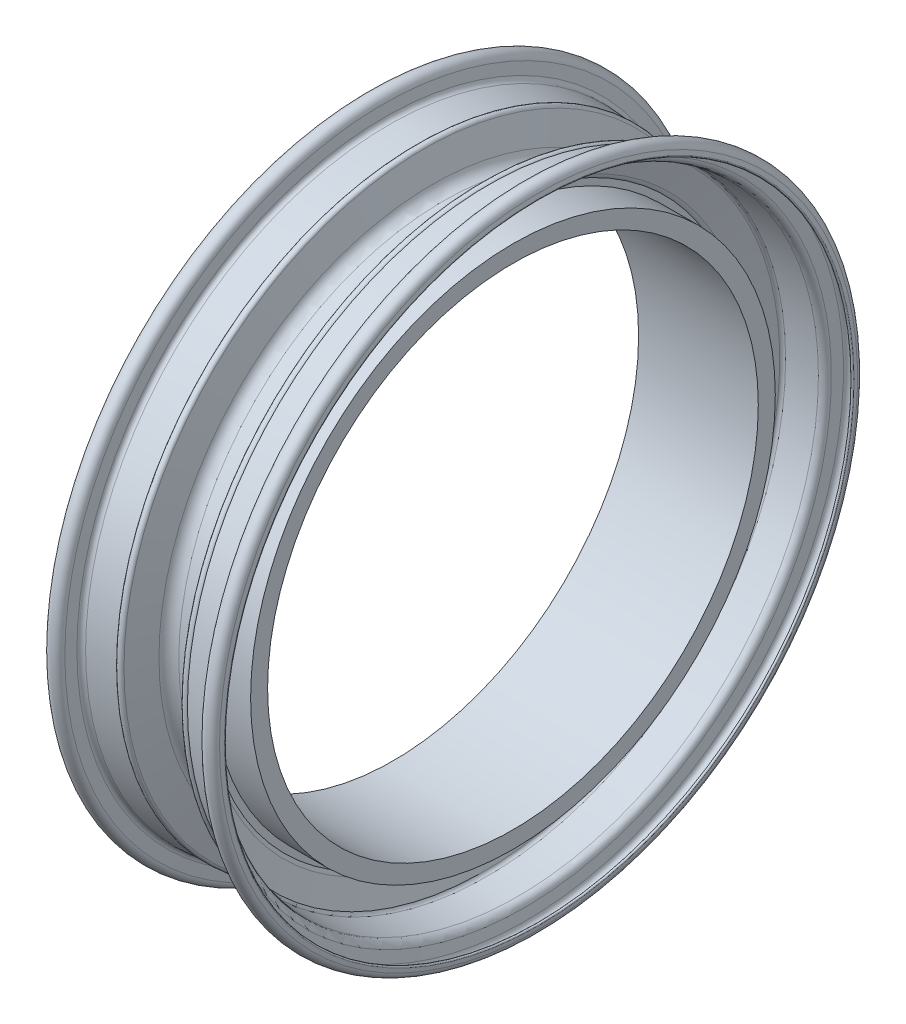
ISO-10303-21;
HEADER;
FILE_DESCRIPTION(('STEP AP214'),'2;1');
FILE_NAME('part.step','',(''),(''),'','','');
FILE_SCHEMA(('AUTOMOTIVE_DESIGN { 1 0 10303 214 1 1 1 1 }'));
ENDSEC;
DATA;
#1=APPLICATION_CONTEXT('core data for automotive mechanical design processes');
#2=APPLICATION_PROTOCOL_DEFINITION('international standard','automotive_design',2000,#1);
#3=PRODUCT_CONTEXT('',#1,'mechanical');
#4=PRODUCT('Part','Part','',(#3));
#5=PRODUCT_RELATED_PRODUCT_CATEGORY('part','',(#4));
#6=PRODUCT_DEFINITION_FORMATION('','',#4);
#7=PRODUCT_DEFINITION_CONTEXT('part definition',#1,'design');
#8=PRODUCT_DEFINITION('design','',#6,#7);
#9=PRODUCT_DEFINITION_SHAPE('','',#8);
#10=(LENGTH_UNIT() NAMED_UNIT(*) SI_UNIT(.MILLI.,.METRE.));
#11=(NAMED_UNIT(*) PLANE_ANGLE_UNIT() SI_UNIT($,.RADIAN.));
#12=(NAMED_UNIT(*) SI_UNIT($,.STERADIAN.) SOLID_ANGLE_UNIT());
#13=UNCERTAINTY_MEASURE_WITH_UNIT(LENGTH_MEASURE(1.E-05),#10,'distance_accuracy_value','');
#14=(GEOMETRIC_REPRESENTATION_CONTEXT(3) GLOBAL_UNCERTAINTY_ASSIGNED_CONTEXT((#13)) GLOBAL_UNIT_ASSIGNED_CONTEXT((#10,
#11,#12)) REPRESENTATION_CONTEXT('',''));
#15=CARTESIAN_POINT('',(0.,0.,0.));
#16=DIRECTION('',(0.,0.,1.));
#17=DIRECTION('',(1.,0.,0.));
#18=AXIS2_PLACEMENT_3D('',#15,#16,#17);
#19=CARTESIAN_POINT('',(-8.99999999999996,0.,0.));
#20=DIRECTION('',(-1.,0.,0.));
#21=DIRECTION('',(0.,0.,1.));
#22=AXIS2_PLACEMENT_3D('',#19,#20,#21);
#23=PLANE('',#22);
#24=CARTESIAN_POINT('',(-8.99999999999996,0.,0.));
#25=DIRECTION('',(1.,0.,0.));
#26=DIRECTION('',(0.,0.,-1.));
#27=AXIS2_PLACEMENT_3D('',#24,#25,#26);
#28=CIRCLE('',#27,112.283375209645);
#29=CARTESIAN_POINT('',(-8.99999999999996,0.,-112.283375209645));
#30=VERTEX_POINT('',#29);
#31=EDGE_CURVE('E72',#30,#30,#28,.F.);
#32=ORIENTED_EDGE('',*,*,#31,.T.);
#33=EDGE_LOOP('',(#32));
#34=FACE_BOUND('',#33,.T.);
#35=CARTESIAN_POINT('',(-8.99999999999995,0.,0.));
#36=DIRECTION('',(-1.,0.,0.));
#37=DIRECTION('',(0.,0.,1.));
#38=AXIS2_PLACEMENT_3D('',#35,#36,#37);
#39=CIRCLE('',#38,109.600000000001);
#40=CARTESIAN_POINT('',(-8.99999999999995,0.,109.600000000001));
#41=VERTEX_POINT('',#40);
#42=EDGE_CURVE('E10',#41,#41,#39,.T.);
#43=ORIENTED_EDGE('',*,*,#42,.F.);
#44=EDGE_LOOP('',(#43));
#45=FACE_BOUND('',#44,.T.);
#46=ADVANCED_FACE('F44',(#34,#45),#23,.T.);
#47=CARTESIAN_POINT('',(-265.819064472506,0.,0.));
#48=DIRECTION('',(-1.,0.,0.));
#49=DIRECTION('',(0.,0.,1.));
#50=AXIS2_PLACEMENT_3D('',#47,#48,#49);
#51=CYLINDRICAL_SURFACE('',#50,109.6);
#52=ORIENTED_EDGE('',*,*,#42,.T.);
#53=EDGE_LOOP('',(#52));
#54=FACE_BOUND('',#53,.T.);
#55=CARTESIAN_POINT('',(-25.,0.,0.));
#56=DIRECTION('',(-1.,0.,0.));
#57=DIRECTION('',(0.,0.,1.));
#58=AXIS2_PLACEMENT_3D('',#55,#56,#57);
#59=CIRCLE('',#58,109.6);
#60=CARTESIAN_POINT('',(-25.,0.,109.6));
#61=VERTEX_POINT('',#60);
#62=EDGE_CURVE('E50',#61,#61,#59,.T.);
#63=ORIENTED_EDGE('',*,*,#62,.F.);
#64=EDGE_LOOP('',(#63));
#65=FACE_BOUND('',#64,.T.);
#66=ADVANCED_FACE('F222',(#54,#65),#51,.T.);
#67=CARTESIAN_POINT('',(-25.,0.,0.));
#68=DIRECTION('',(-1.,0.,0.));
#69=DIRECTION('',(0.,0.,1.));
#70=AXIS2_PLACEMENT_3D('',#67,#68,#69);
#71=PLANE('',#70);
#72=ORIENTED_EDGE('',*,*,#62,.T.);
#73=EDGE_LOOP('',(#72));
#74=FACE_BOUND('',#73,.T.);
#75=CARTESIAN_POINT('',(-25.,0.,0.));
#76=DIRECTION('',(-1.,0.,0.));
#77=DIRECTION('',(0.,0.,1.));
#78=AXIS2_PLACEMENT_3D('',#75,#76,#77);
#79=CIRCLE('',#78,102.5);
#80=CARTESIAN_POINT('',(-25.,0.,102.5));
#81=VERTEX_POINT('',#80);
#82=EDGE_CURVE('E54',#81,#81,#79,.T.);
#83=ORIENTED_EDGE('',*,*,#82,.F.);
#84=EDGE_LOOP('',(#83));
#85=FACE_BOUND('',#84,.T.);
#86=ADVANCED_FACE('F227',(#74,#85),#71,.T.);
#87=CARTESIAN_POINT('',(-265.819064472506,0.,0.));
#88=DIRECTION('',(-1.,0.,0.));
#89=DIRECTION('',(0.,0.,1.));
#90=AXIS2_PLACEMENT_3D('',#87,#88,#89);
#91=CYLINDRICAL_SURFACE('',#90,102.5);
#92=CARTESIAN_POINT('',(25.,0.,0.));
#93=DIRECTION('',(-1.,0.,0.));
#94=DIRECTION('',(0.,0.,1.));
#95=AXIS2_PLACEMENT_3D('',#92,#93,#94);
#96=CIRCLE('',#95,102.5);
#97=CARTESIAN_POINT('',(25.,0.,102.5));
#98=VERTEX_POINT('',#97);
#99=EDGE_CURVE('E58',#98,#98,#96,.T.);
#100=ORIENTED_EDGE('',*,*,#99,.F.);
#101=EDGE_LOOP('',(#100));
#102=FACE_BOUND('',#101,.T.);
#103=ORIENTED_EDGE('',*,*,#82,.T.);
#104=EDGE_LOOP('',(#103));
#105=FACE_BOUND('',#104,.T.);
#106=ADVANCED_FACE('F256',(#102,#105),#91,.F.);
#107=CARTESIAN_POINT('',(25.,3.17625425178869E-13,0.));
#108=DIRECTION('',(-1.,0.,0.));
#109=DIRECTION('',(0.,0.,1.));
#110=AXIS2_PLACEMENT_3D('',#107,#108,#109);
#111=PLANE('',#110);
#112=CARTESIAN_POINT('',(25.,0.,0.));
#113=DIRECTION('',(-1.,0.,0.));
#114=DIRECTION('',(0.,0.,1.));
#115=AXIS2_PLACEMENT_3D('',#112,#113,#114);
#116=CIRCLE('',#115,109.6);
#117=CARTESIAN_POINT('',(25.,0.,109.6));
#118=VERTEX_POINT('',#117);
#119=EDGE_CURVE('E63',#118,#118,#116,.T.);
#120=ORIENTED_EDGE('',*,*,#119,.F.);
#121=EDGE_LOOP('',(#120));
#122=FACE_BOUND('',#121,.T.);
#123=ORIENTED_EDGE('',*,*,#99,.T.);
#124=EDGE_LOOP('',(#123));
#125=FACE_BOUND('',#124,.T.);
#126=ADVANCED_FACE('F252',(#122,#125),#111,.F.);
#127=CARTESIAN_POINT('',(-265.819064472506,0.,0.));
#128=DIRECTION('',(-1.,0.,0.));
#129=DIRECTION('',(0.,0.,1.));
#130=AXIS2_PLACEMENT_3D('',#127,#128,#129);
#131=CYLINDRICAL_SURFACE('',#130,109.6);
#132=CARTESIAN_POINT('',(9.00000000000006,0.,0.));
#133=DIRECTION('',(-1.,0.,0.));
#134=DIRECTION('',(0.,0.,1.));
#135=AXIS2_PLACEMENT_3D('',#132,#133,#134);
#136=CIRCLE('',#135,109.600000000001);
#137=CARTESIAN_POINT('',(9.00000000000006,0.,109.600000000001));
#138=VERTEX_POINT('',#137);
#139=EDGE_CURVE('E66',#138,#138,#136,.T.);
#140=ORIENTED_EDGE('',*,*,#139,.F.);
#141=EDGE_LOOP('',(#140));
#142=FACE_BOUND('',#141,.T.);
#143=ORIENTED_EDGE('',*,*,#119,.T.);
#144=EDGE_LOOP('',(#143));
#145=FACE_BOUND('',#144,.T.);
#146=ADVANCED_FACE('F248',(#142,#145),#131,.T.);
#147=CARTESIAN_POINT('',(9.00000000000004,0.,0.));
#148=DIRECTION('',(-1.,0.,0.));
#149=DIRECTION('',(0.,0.,1.));
#150=AXIS2_PLACEMENT_3D('',#147,#148,#149);
#151=PLANE('',#150);
#152=CARTESIAN_POINT('',(9.00000000000006,0.,0.));
#153=DIRECTION('',(-1.,0.,0.));
#154=DIRECTION('',(0.,0.,1.));
#155=AXIS2_PLACEMENT_3D('',#152,#153,#154);
#156=CIRCLE('',#155,112.283375209645);
#157=CARTESIAN_POINT('',(9.00000000000006,0.,112.283375209645));
#158=VERTEX_POINT('',#157);
#159=EDGE_CURVE('E69',#158,#158,#156,.T.);
#160=ORIENTED_EDGE('',*,*,#159,.F.);
#161=EDGE_LOOP('',(#160));
#162=FACE_BOUND('',#161,.T.);
#163=ORIENTED_EDGE('',*,*,#139,.T.);
#164=EDGE_LOOP('',(#163));
#165=FACE_BOUND('',#164,.T.);
#166=ADVANCED_FACE('F242',(#162,#165),#151,.F.);
#167=CARTESIAN_POINT('',(4.,0.,0.));
#168=DIRECTION('',(-1.,0.,0.));
#169=DIRECTION('',(0.,0.,1.));
#170=AXIS2_PLACEMENT_3D('',#167,#168,#169);
#171=TOROIDAL_SURFACE('',#170,115.6,6.00000000000002);
#172=CARTESIAN_POINT('',(9.7273416350413,0.,0.));
#173=DIRECTION('',(-1.,0.,0.));
#174=DIRECTION('',(0.,0.,1.));
#175=AXIS2_PLACEMENT_3D('',#172,#173,#174);
#176=CIRCLE('',#175,113.811828365195);
#177=CARTESIAN_POINT('',(9.7273416350413,0.,113.811828365195));
#178=VERTEX_POINT('',#177);
#179=EDGE_CURVE('E75',#178,#178,#176,.T.);
#180=ORIENTED_EDGE('',*,*,#179,.F.);
#181=EDGE_LOOP('',(#180));
#182=FACE_BOUND('',#181,.T.);
#183=ORIENTED_EDGE('',*,*,#159,.T.);
#184=EDGE_LOOP('',(#183));
#185=FACE_BOUND('',#184,.T.);
#186=ADVANCED_FACE('F233',(#182,#185),#171,.T.);
#187=CARTESIAN_POINT('',(-4.,0.,0.));
#188=DIRECTION('',(-1.,0.,0.));
#189=DIRECTION('',(0.,0.,1.));
#190=AXIS2_PLACEMENT_3D('',#187,#188,#189);
#191=TOROIDAL_SURFACE('',#190,115.6,6.00000000000001);
#192=ORIENTED_EDGE('',*,*,#31,.F.);
#193=EDGE_LOOP('',(#192));
#194=FACE_BOUND('',#193,.T.);
#195=CARTESIAN_POINT('',(-9.7273416350413,0.,0.));
#196=DIRECTION('',(-1.,0.,0.));
#197=DIRECTION('',(0.,0.,1.));
#198=AXIS2_PLACEMENT_3D('',#195,#196,#197);
#199=CIRCLE('',#198,113.811828365195);
#200=CARTESIAN_POINT('',(-9.7273416350413,0.,113.811828365195));
#201=VERTEX_POINT('',#200);
#202=EDGE_CURVE('E174',#201,#201,#199,.T.);
#203=ORIENTED_EDGE('',*,*,#202,.T.);
#204=EDGE_LOOP('',(#203));
#205=FACE_BOUND('',#204,.T.);
#206=ADVANCED_FACE('F178',(#194,#205),#191,.T.);
#207=CARTESIAN_POINT('',(12.8006495388056,0.,0.));
#208=DIRECTION('',(1.,0.,0.));
#209=DIRECTION('',(0.,0.,-1.));
#210=AXIS2_PLACEMENT_3D('',#207,#208,#209);
#211=CONICAL_SURFACE('',#210,123.655337775546,1.26816958578399);
#212=ORIENTED_EDGE('',*,*,#179,.T.);
#213=EDGE_LOOP('',(#212));
#214=FACE_BOUND('',#213,.T.);
#215=CARTESIAN_POINT('',(12.8006495388056,0.,0.));
#216=DIRECTION('',(-1.,0.,0.));
#217=DIRECTION('',(0.,0.,1.));
#218=AXIS2_PLACEMENT_3D('',#215,#216,#217);
#219=CIRCLE('',#218,123.655337775546);
#220=CARTESIAN_POINT('',(12.8006495388056,0.,123.655337775546));
#221=VERTEX_POINT('',#220);
#222=EDGE_CURVE('E78',#221,#221,#219,.T.);
#223=ORIENTED_EDGE('',*,*,#222,.F.);
#224=EDGE_LOOP('',(#223));
#225=FACE_BOUND('',#224,.T.);
#226=ADVANCED_FACE('F232',(#214,#225),#211,.F.);
#227=CARTESIAN_POINT('',(14.296236304983,0.,0.));
#228=DIRECTION('',(-1.,0.,0.));
#229=DIRECTION('',(0.,0.,1.));
#230=AXIS2_PLACEMENT_3D('',#227,#228,#229);
#231=TOROIDAL_SURFACE('',#230,123.188390629193,1.56678633280091);
#232=ORIENTED_EDGE('',*,*,#222,.T.);
#233=EDGE_LOOP('',(#232));
#234=FACE_BOUND('',#233,.T.);
#235=CARTESIAN_POINT('',(14.1794104018579,0.,0.));
#236=DIRECTION('',(-1.,0.,0.));
#237=DIRECTION('',(0.,0.,1.));
#238=AXIS2_PLACEMENT_3D('',#235,#236,#237);
#239=CIRCLE('',#238,124.750815386105);
#240=CARTESIAN_POINT('',(14.1794104018579,0.,124.750815386105));
#241=VERTEX_POINT('',#240);
#242=EDGE_CURVE('E81',#241,#241,#239,.T.);
#243=ORIENTED_EDGE('',*,*,#242,.F.);
#244=EDGE_LOOP('',(#243));
#245=FACE_BOUND('',#244,.T.);
#246=ADVANCED_FACE('F239',(#234,#245),#231,.F.);
#247=CARTESIAN_POINT('',(26.9109958987321,0.,0.));
#248=DIRECTION('',(1.,0.,0.));
#249=DIRECTION('',(0.,0.,-1.));
#250=AXIS2_PLACEMENT_3D('',#247,#248,#249);
#251=CONICAL_SURFACE('',#250,125.702783771979,0.0746332968894555);
#252=ORIENTED_EDGE('',*,*,#242,.T.);
#253=EDGE_LOOP('',(#252));
#254=FACE_BOUND('',#253,.T.);
#255=CARTESIAN_POINT('',(26.9109958987321,0.,0.));
#256=DIRECTION('',(-1.,0.,0.));
#257=DIRECTION('',(0.,0.,1.));
#258=AXIS2_PLACEMENT_3D('',#255,#256,#257);
#259=CIRCLE('',#258,125.702783771979);
#260=CARTESIAN_POINT('',(26.9109958987321,0.,125.702783771979));
#261=VERTEX_POINT('',#260);
#262=EDGE_CURVE('E84',#261,#261,#259,.T.);
#263=ORIENTED_EDGE('',*,*,#262,.F.);
#264=EDGE_LOOP('',(#263));
#265=FACE_BOUND('',#264,.T.);
#266=ADVANCED_FACE('F314',(#254,#265),#251,.F.);
#267=CARTESIAN_POINT('',(26.6873038087274,0.,0.));
#268=DIRECTION('',(-1.,0.,0.));
#269=DIRECTION('',(0.,0.,1.));
#270=AXIS2_PLACEMENT_3D('',#267,#268,#269);
#271=TOROIDAL_SURFACE('',#270,128.694432456044,3.);
#272=ORIENTED_EDGE('',*,*,#262,.T.);
#273=EDGE_LOOP('',(#272));
#274=FACE_BOUND('',#273,.T.);
#275=CARTESIAN_POINT('',(29.6708694948322,0.,0.));
#276=DIRECTION('',(-1.,0.,0.));
#277=DIRECTION('',(0.,0.,1.));
#278=AXIS2_PLACEMENT_3D('',#275,#276,#277);
#279=CIRCLE('',#278,128.380847066241);
#280=CARTESIAN_POINT('',(29.6708694948322,0.,128.380847066241));
#281=VERTEX_POINT('',#280);
#282=EDGE_CURVE('E87',#281,#281,#279,.T.);
#283=ORIENTED_EDGE('',*,*,#282,.F.);
#284=EDGE_LOOP('',(#283));
#285=FACE_BOUND('',#284,.T.);
#286=ADVANCED_FACE('F324',(#274,#285),#271,.T.);
#287=CARTESIAN_POINT('',(30.1500994445795,0.,0.));
#288=DIRECTION('',(1.,0.,0.));
#289=DIRECTION('',(0.,0.,-1.));
#290=AXIS2_PLACEMENT_3D('',#287,#288,#289);
#291=CONICAL_SURFACE('',#290,132.940415465516,1.46607657167525);
#292=ORIENTED_EDGE('',*,*,#282,.T.);
#293=EDGE_LOOP('',(#292));
#294=FACE_BOUND('',#293,.T.);
#295=CARTESIAN_POINT('',(30.1500994445795,0.,0.));
#296=DIRECTION('',(-1.,0.,0.));
#297=DIRECTION('',(0.,0.,1.));
#298=AXIS2_PLACEMENT_3D('',#295,#296,#297);
#299=CIRCLE('',#298,132.940415465516);
#300=CARTESIAN_POINT('',(30.1500994445795,0.,132.940415465516));
#301=VERTEX_POINT('',#300);
#302=EDGE_CURVE('E90',#301,#301,#299,.T.);
#303=ORIENTED_EDGE('',*,*,#302,.F.);
#304=EDGE_LOOP('',(#303));
#305=FACE_BOUND('',#304,.T.);
#306=ADVANCED_FACE('F334',(#294,#305),#291,.F.);
#307=CARTESIAN_POINT('',(32.4374998039266,0.,0.));
#308=DIRECTION('',(-1.,0.,0.));
#309=DIRECTION('',(0.,0.,1.));
#310=AXIS2_PLACEMENT_3D('',#307,#308,#309);
#311=TOROIDAL_SURFACE('',#310,132.7,2.29999999999996);
#312=CARTESIAN_POINT('',(34.7025576358545,0.,0.));
#313=DIRECTION('',(-1.,0.,0.));
#314=DIRECTION('',(0.,0.,1.));
#315=AXIS2_PLACEMENT_3D('',#312,#313,#314);
#316=CIRCLE('',#315,133.099390808635);
#317=CARTESIAN_POINT('',(34.7025576358545,0.,133.099390808635));
#318=VERTEX_POINT('',#317);
#319=EDGE_CURVE('E93',#318,#318,#316,.T.);
#320=ORIENTED_EDGE('',*,*,#319,.F.);
#321=EDGE_LOOP('',(#320));
#322=FACE_BOUND('',#321,.T.);
#323=ORIENTED_EDGE('',*,*,#302,.T.);
#324=EDGE_LOOP('',(#323));
#325=FACE_BOUND('',#324,.T.);
#326=ADVANCED_FACE('F344',(#322,#325),#311,.F.);
#327=CARTESIAN_POINT('',(34.7025576358545,0.,0.));
#328=DIRECTION('',(-1.,0.,0.));
#329=DIRECTION('',(0.,0.,1.));
#330=AXIS2_PLACEMENT_3D('',#327,#328,#329);
#331=CONICAL_SURFACE('',#330,133.099390808635,1.3962634015953);
#332=CARTESIAN_POINT('',(35.0151922469878,0.,0.));
#333=DIRECTION('',(-1.,0.,0.));
#334=DIRECTION('',(0.,0.,1.));
#335=AXIS2_PLACEMENT_3D('',#332,#333,#334);
#336=CIRCLE('',#335,131.326351822333);
#337=CARTESIAN_POINT('',(35.0151922469878,0.,131.326351822333));
#338=VERTEX_POINT('',#337);
#339=EDGE_CURVE('E96',#338,#338,#336,.T.);
#340=ORIENTED_EDGE('',*,*,#339,.F.);
#341=EDGE_LOOP('',(#340));
#342=FACE_BOUND('',#341,.T.);
#343=ORIENTED_EDGE('',*,*,#319,.T.);
#344=EDGE_LOOP('',(#343));
#345=FACE_BOUND('',#344,.T.);
#346=ADVANCED_FACE('F354',(#342,#345),#331,.F.);
#347=CARTESIAN_POINT('',(35.5075961234939,0.,0.));
#348=DIRECTION('',(-1.,0.,0.));
#349=DIRECTION('',(0.,0.,1.));
#350=AXIS2_PLACEMENT_3D('',#347,#348,#349);
#351=TOROIDAL_SURFACE('',#350,131.413175911166,0.499999999999999);
#352=ORIENTED_EDGE('',*,*,#339,.T.);
#353=EDGE_LOOP('',(#352));
#354=FACE_BOUND('',#353,.T.);
#355=CARTESIAN_POINT('',(36.,0.,0.));
#356=DIRECTION('',(-1.,0.,0.));
#357=DIRECTION('',(0.,0.,1.));
#358=AXIS2_PLACEMENT_3D('',#355,#356,#357);
#359=CIRCLE('',#358,131.5);
#360=CARTESIAN_POINT('',(36.,0.,131.5));
#361=VERTEX_POINT('',#360);
#362=EDGE_CURVE('E99',#361,#361,#359,.T.);
#363=ORIENTED_EDGE('',*,*,#362,.F.);
#364=EDGE_LOOP('',(#363));
#365=FACE_BOUND('',#364,.T.);
#366=ADVANCED_FACE('F364',(#354,#365),#351,.T.);
#367=CARTESIAN_POINT('',(35.6873653888667,0.,0.));
#368=DIRECTION('',(-1.,0.,0.));
#369=DIRECTION('',(0.,0.,1.));
#370=AXIS2_PLACEMENT_3D('',#367,#368,#369);
#371=CONICAL_SURFACE('',#370,133.273038986302,1.39626340159535);
#372=ORIENTED_EDGE('',*,*,#362,.T.);
#373=EDGE_LOOP('',(#372));
#374=FACE_BOUND('',#373,.T.);
#375=CARTESIAN_POINT('',(35.6873653888667,0.,0.));
#376=DIRECTION('',(-1.,0.,0.));
#377=DIRECTION('',(0.,0.,1.));
#378=AXIS2_PLACEMENT_3D('',#375,#376,#377);
#379=CIRCLE('',#378,133.273038986302);
#380=CARTESIAN_POINT('',(35.6873653888667,0.,133.273038986302));
#381=VERTEX_POINT('',#380);
#382=EDGE_CURVE('E102',#381,#381,#379,.T.);
#383=ORIENTED_EDGE('',*,*,#382,.F.);
#384=EDGE_LOOP('',(#383));
#385=FACE_BOUND('',#384,.T.);
#386=ADVANCED_FACE('F374',(#374,#385),#371,.T.);
#387=CARTESIAN_POINT('',(32.4374998039266,0.,0.));
#388=DIRECTION('',(-1.,0.,0.));
#389=DIRECTION('',(0.,0.,1.));
#390=AXIS2_PLACEMENT_3D('',#387,#388,#389);
#391=TOROIDAL_SURFACE('',#390,132.7,3.3);
#392=ORIENTED_EDGE('',*,*,#382,.T.);
#393=EDGE_LOOP('',(#392));
#394=FACE_BOUND('',#393,.T.);
#395=CARTESIAN_POINT('',(29.1555775492113,0.,0.));
#396=DIRECTION('',(-1.,0.,0.));
#397=DIRECTION('',(0.,0.,1.));
#398=AXIS2_PLACEMENT_3D('',#395,#396,#397);
#399=CIRCLE('',#398,133.044943928784);
#400=CARTESIAN_POINT('',(29.1555775492113,0.,133.044943928784));
#401=VERTEX_POINT('',#400);
#402=EDGE_CURVE('E105',#401,#401,#399,.T.);
#403=ORIENTED_EDGE('',*,*,#402,.F.);
#404=EDGE_LOOP('',(#403));
#405=FACE_BOUND('',#404,.T.);
#406=ADVANCED_FACE('F384',(#394,#405),#391,.T.);
#407=CARTESIAN_POINT('',(29.1555775492113,0.,0.));
#408=DIRECTION('',(1.,0.,0.));
#409=DIRECTION('',(0.,0.,-1.));
#410=AXIS2_PLACEMENT_3D('',#407,#408,#409);
#411=CONICAL_SURFACE('',#410,133.044943928784,1.46607657167524);
#412=CARTESIAN_POINT('',(28.6763475994639,0.,0.));
#413=DIRECTION('',(-1.,0.,0.));
#414=DIRECTION('',(0.,0.,1.));
#415=AXIS2_PLACEMENT_3D('',#412,#413,#414);
#416=CIRCLE('',#415,128.485375529509);
#417=CARTESIAN_POINT('',(28.6763475994639,0.,128.485375529509));
#418=VERTEX_POINT('',#417);
#419=EDGE_CURVE('E108',#418,#418,#416,.T.);
#420=ORIENTED_EDGE('',*,*,#419,.F.);
#421=EDGE_LOOP('',(#420));
#422=FACE_BOUND('',#421,.T.);
#423=ORIENTED_EDGE('',*,*,#402,.T.);
#424=EDGE_LOOP('',(#423));
#425=FACE_BOUND('',#424,.T.);
#426=ADVANCED_FACE('F394',(#422,#425),#411,.T.);
#427=CARTESIAN_POINT('',(26.6873038087274,0.,0.));
#428=DIRECTION('',(-1.,0.,0.));
#429=DIRECTION('',(0.,0.,1.));
#430=AXIS2_PLACEMENT_3D('',#427,#428,#429);
#431=TOROIDAL_SURFACE('',#430,128.694432456044,2.);
#432=CARTESIAN_POINT('',(26.8364318687305,0.,0.));
#433=DIRECTION('',(-1.,0.,0.));
#434=DIRECTION('',(0.,0.,1.));
#435=AXIS2_PLACEMENT_3D('',#432,#433,#434);
#436=CIRCLE('',#435,126.700000000001);
#437=CARTESIAN_POINT('',(26.8364318687305,0.,126.700000000001));
#438=VERTEX_POINT('',#437);
#439=EDGE_CURVE('E111',#438,#438,#436,.T.);
#440=ORIENTED_EDGE('',*,*,#439,.F.);
#441=EDGE_LOOP('',(#440));
#442=FACE_BOUND('',#441,.T.);
#443=ORIENTED_EDGE('',*,*,#419,.T.);
#444=EDGE_LOOP('',(#443));
#445=FACE_BOUND('',#444,.T.);
#446=ADVANCED_FACE('F404',(#442,#445),#431,.F.);
#447=CARTESIAN_POINT('',(26.8364318687305,0.,0.));
#448=DIRECTION('',(1.,0.,0.));
#449=DIRECTION('',(0.,0.,-1.));
#450=AXIS2_PLACEMENT_3D('',#447,#448,#449);
#451=CONICAL_SURFACE('',#450,126.700000000001,0.074633296889453);
#452=CARTESIAN_POINT('',(14.7998693975103,0.,0.));
#453=DIRECTION('',(-1.,0.,0.));
#454=DIRECTION('',(0.,0.,1.));
#455=AXIS2_PLACEMENT_3D('',#452,#453,#454);
#456=CIRCLE('',#455,125.8);
#457=CARTESIAN_POINT('',(14.7998693975103,0.,125.8));
#458=VERTEX_POINT('',#457);
#459=EDGE_CURVE('E114',#458,#458,#456,.T.);
#460=ORIENTED_EDGE('',*,*,#459,.F.);
#461=EDGE_LOOP('',(#460));
#462=FACE_BOUND('',#461,.T.);
#463=ORIENTED_EDGE('',*,*,#439,.T.);
#464=EDGE_LOOP('',(#463));
#465=FACE_BOUND('',#464,.T.);
#466=ADVANCED_FACE('F414',(#462,#465),#451,.T.);
#467=CARTESIAN_POINT('',(13.6818354087604,0.,0.));
#468=DIRECTION('',(-1.,0.,0.));
#469=DIRECTION('',(0.,0.,1.));
#470=AXIS2_PLACEMENT_3D('',#467,#468,#469);
#471=TOROIDAL_SURFACE('',#470,124.8,1.50000000000006);
#472=ORIENTED_EDGE('',*,*,#459,.T.);
#473=EDGE_LOOP('',(#472));
#474=FACE_BOUND('',#473,.T.);
#475=CARTESIAN_POINT('',(12.25,0.,0.));
#476=DIRECTION('',(-1.,0.,0.));
#477=DIRECTION('',(0.,0.,1.));
#478=AXIS2_PLACEMENT_3D('',#475,#476,#477);
#479=CIRCLE('',#478,125.247042908701);
#480=CARTESIAN_POINT('',(12.25,0.,125.247042908701));
#481=VERTEX_POINT('',#480);
#482=EDGE_CURVE('E117',#481,#481,#479,.T.);
#483=ORIENTED_EDGE('',*,*,#482,.F.);
#484=EDGE_LOOP('',(#483));
#485=FACE_BOUND('',#484,.T.);
#486=ADVANCED_FACE('F424',(#474,#485),#471,.T.);
#487=CARTESIAN_POINT('',(12.25,0.,0.));
#488=DIRECTION('',(1.,0.,0.));
#489=DIRECTION('',(0.,0.,-1.));
#490=AXIS2_PLACEMENT_3D('',#487,#488,#489);
#491=CONICAL_SURFACE('',#490,125.247042908701,1.268169585784);
#492=CARTESIAN_POINT('',(8.77278469586773,0.,0.));
#493=DIRECTION('',(-1.,0.,0.));
#494=DIRECTION('',(0.,0.,1.));
#495=AXIS2_PLACEMENT_3D('',#492,#493,#494);
#496=CIRCLE('',#495,114.109856970995);
#497=CARTESIAN_POINT('',(8.77278469586773,0.,114.109856970995));
#498=VERTEX_POINT('',#497);
#499=EDGE_CURVE('E120',#498,#498,#496,.T.);
#500=ORIENTED_EDGE('',*,*,#499,.F.);
#501=EDGE_LOOP('',(#500));
#502=FACE_BOUND('',#501,.T.);
#503=ORIENTED_EDGE('',*,*,#482,.T.);
#504=EDGE_LOOP('',(#503));
#505=FACE_BOUND('',#504,.T.);
#506=ADVANCED_FACE('F434',(#502,#505),#491,.T.);
#507=CARTESIAN_POINT('',(4.,0.,0.));
#508=DIRECTION('',(-1.,0.,0.));
#509=DIRECTION('',(0.,0.,1.));
#510=AXIS2_PLACEMENT_3D('',#507,#508,#509);
#511=TOROIDAL_SURFACE('',#510,115.6,5.00000000000002);
#512=CARTESIAN_POINT('',(4.00000000000006,0.,0.));
#513=DIRECTION('',(-1.,0.,0.));
#514=DIRECTION('',(0.,0.,1.));
#515=AXIS2_PLACEMENT_3D('',#512,#513,#514);
#516=CIRCLE('',#515,110.6);
#517=CARTESIAN_POINT('',(4.00000000000006,0.,110.6));
#518=VERTEX_POINT('',#517);
#519=EDGE_CURVE('E123',#518,#518,#516,.T.);
#520=ORIENTED_EDGE('',*,*,#519,.F.);
#521=EDGE_LOOP('',(#520));
#522=FACE_BOUND('',#521,.T.);
#523=ORIENTED_EDGE('',*,*,#499,.T.);
#524=EDGE_LOOP('',(#523));
#525=FACE_BOUND('',#524,.T.);
#526=ADVANCED_FACE('F444',(#522,#525),#511,.F.);
#527=CARTESIAN_POINT('',(-265.819064472506,0.,0.));
#528=DIRECTION('',(-1.,0.,0.));
#529=DIRECTION('',(0.,0.,1.));
#530=AXIS2_PLACEMENT_3D('',#527,#528,#529);
#531=CYLINDRICAL_SURFACE('',#530,110.6);
#532=ORIENTED_EDGE('',*,*,#519,.T.);
#533=EDGE_LOOP('',(#532));
#534=FACE_BOUND('',#533,.T.);
#535=CARTESIAN_POINT('',(-3.99999999999995,0.,0.));
#536=DIRECTION('',(-1.,0.,0.));
#537=DIRECTION('',(0.,0.,1.));
#538=AXIS2_PLACEMENT_3D('',#535,#536,#537);
#539=CIRCLE('',#538,110.6);
#540=CARTESIAN_POINT('',(-3.99999999999995,0.,110.6));
#541=VERTEX_POINT('',#540);
#542=EDGE_CURVE('E126',#541,#541,#539,.T.);
#543=ORIENTED_EDGE('',*,*,#542,.F.);
#544=EDGE_LOOP('',(#543));
#545=FACE_BOUND('',#544,.T.);
#546=ADVANCED_FACE('F454',(#534,#545),#531,.T.);
#547=CARTESIAN_POINT('',(-4.,0.,0.));
#548=DIRECTION('',(-1.,0.,0.));
#549=DIRECTION('',(0.,0.,1.));
#550=AXIS2_PLACEMENT_3D('',#547,#548,#549);
#551=TOROIDAL_SURFACE('',#550,115.6,4.99999999999998);
#552=ORIENTED_EDGE('',*,*,#542,.T.);
#553=EDGE_LOOP('',(#552));
#554=FACE_BOUND('',#553,.T.);
#555=CARTESIAN_POINT('',(-8.77278469586767,0.,0.));
#556=DIRECTION('',(-1.,0.,0.));
#557=DIRECTION('',(0.,0.,1.));
#558=AXIS2_PLACEMENT_3D('',#555,#556,#557);
#559=CIRCLE('',#558,114.109856970995);
#560=CARTESIAN_POINT('',(-8.77278469586767,0.,114.109856970995));
#561=VERTEX_POINT('',#560);
#562=EDGE_CURVE('E129',#561,#561,#559,.T.);
#563=ORIENTED_EDGE('',*,*,#562,.F.);
#564=EDGE_LOOP('',(#563));
#565=FACE_BOUND('',#564,.T.);
#566=ADVANCED_FACE('F464',(#554,#565),#551,.F.);
#567=CARTESIAN_POINT('',(-12.25,0.,0.));
#568=DIRECTION('',(-1.,0.,0.));
#569=DIRECTION('',(0.,0.,1.));
#570=AXIS2_PLACEMENT_3D('',#567,#568,#569);
#571=CONICAL_SURFACE('',#570,125.247042908701,1.26816958578399);
#572=ORIENTED_EDGE('',*,*,#562,.T.);
#573=EDGE_LOOP('',(#572));
#574=FACE_BOUND('',#573,.T.);
#575=CARTESIAN_POINT('',(-12.25,0.,0.));
#576=DIRECTION('',(-1.,0.,0.));
#577=DIRECTION('',(0.,0.,1.));
#578=AXIS2_PLACEMENT_3D('',#575,#576,#577);
#579=CIRCLE('',#578,125.247042908701);
#580=CARTESIAN_POINT('',(-12.25,0.,125.247042908701));
#581=VERTEX_POINT('',#580);
#582=EDGE_CURVE('E132',#581,#581,#579,.T.);
#583=ORIENTED_EDGE('',*,*,#582,.F.);
#584=EDGE_LOOP('',(#583));
#585=FACE_BOUND('',#584,.T.);
#586=ADVANCED_FACE('F474',(#574,#585),#571,.T.);
#587=CARTESIAN_POINT('',(-13.6818354087603,0.,0.));
#588=DIRECTION('',(-1.,0.,0.));
#589=DIRECTION('',(0.,0.,1.));
#590=AXIS2_PLACEMENT_3D('',#587,#588,#589);
#591=TOROIDAL_SURFACE('',#590,124.8,1.50000000000002);
#592=CARTESIAN_POINT('',(-14.7998693975102,0.,0.));
#593=DIRECTION('',(-1.,0.,0.));
#594=DIRECTION('',(0.,0.,1.));
#595=AXIS2_PLACEMENT_3D('',#592,#593,#594);
#596=CIRCLE('',#595,125.8);
#597=CARTESIAN_POINT('',(-14.7998693975102,0.,125.8));
#598=VERTEX_POINT('',#597);
#599=EDGE_CURVE('E135',#598,#598,#596,.T.);
#600=ORIENTED_EDGE('',*,*,#599,.F.);
#601=EDGE_LOOP('',(#600));
#602=FACE_BOUND('',#601,.T.);
#603=ORIENTED_EDGE('',*,*,#582,.T.);
#604=EDGE_LOOP('',(#603));
#605=FACE_BOUND('',#604,.T.);
#606=ADVANCED_FACE('F484',(#602,#605),#591,.T.);
#607=CARTESIAN_POINT('',(-26.8364318687305,0.,0.));
#608=DIRECTION('',(-1.,0.,0.));
#609=DIRECTION('',(0.,0.,1.));
#610=AXIS2_PLACEMENT_3D('',#607,#608,#609);
#611=CONICAL_SURFACE('',#610,126.700000000001,0.0746332968894527);
#612=ORIENTED_EDGE('',*,*,#599,.T.);
#613=EDGE_LOOP('',(#612));
#614=FACE_BOUND('',#613,.T.);
#615=CARTESIAN_POINT('',(-26.8364318687305,0.,0.));
#616=DIRECTION('',(-1.,0.,0.));
#617=DIRECTION('',(0.,0.,1.));
#618=AXIS2_PLACEMENT_3D('',#615,#616,#617);
#619=CIRCLE('',#618,126.700000000001);
#620=CARTESIAN_POINT('',(-26.8364318687305,0.,126.700000000001));
#621=VERTEX_POINT('',#620);
#622=EDGE_CURVE('E138',#621,#621,#619,.T.);
#623=ORIENTED_EDGE('',*,*,#622,.F.);
#624=EDGE_LOOP('',(#623));
#625=FACE_BOUND('',#624,.T.);
#626=ADVANCED_FACE('F494',(#614,#625),#611,.T.);
#627=CARTESIAN_POINT('',(-26.6873038087273,0.,0.));
#628=DIRECTION('',(-1.,0.,0.));
#629=DIRECTION('',(0.,0.,1.));
#630=AXIS2_PLACEMENT_3D('',#627,#628,#629);
#631=TOROIDAL_SURFACE('',#630,128.694432456044,2.);
#632=ORIENTED_EDGE('',*,*,#622,.T.);
#633=EDGE_LOOP('',(#632));
#634=FACE_BOUND('',#633,.T.);
#635=CARTESIAN_POINT('',(-28.6763475994638,0.,0.));
#636=DIRECTION('',(-1.,0.,0.));
#637=DIRECTION('',(0.,0.,1.));
#638=AXIS2_PLACEMENT_3D('',#635,#636,#637);
#639=CIRCLE('',#638,128.485375529509);
#640=CARTESIAN_POINT('',(-28.6763475994638,0.,128.485375529509));
#641=VERTEX_POINT('',#640);
#642=EDGE_CURVE('E141',#641,#641,#639,.T.);
#643=ORIENTED_EDGE('',*,*,#642,.F.);
#644=EDGE_LOOP('',(#643));
#645=FACE_BOUND('',#644,.T.);
#646=ADVANCED_FACE('F504',(#634,#645),#631,.F.);
#647=CARTESIAN_POINT('',(-29.1555775492112,0.,0.));
#648=DIRECTION('',(-1.,0.,0.));
#649=DIRECTION('',(0.,0.,1.));
#650=AXIS2_PLACEMENT_3D('',#647,#648,#649);
#651=CONICAL_SURFACE('',#650,133.044943928784,1.46607657167524);
#652=ORIENTED_EDGE('',*,*,#642,.T.);
#653=EDGE_LOOP('',(#652));
#654=FACE_BOUND('',#653,.T.);
#655=CARTESIAN_POINT('',(-29.1555775492112,0.,0.));
#656=DIRECTION('',(-1.,0.,0.));
#657=DIRECTION('',(0.,0.,1.));
#658=AXIS2_PLACEMENT_3D('',#655,#656,#657);
#659=CIRCLE('',#658,133.044943928784);
#660=CARTESIAN_POINT('',(-29.1555775492112,0.,133.044943928784));
#661=VERTEX_POINT('',#660);
#662=EDGE_CURVE('E144',#661,#661,#659,.T.);
#663=ORIENTED_EDGE('',*,*,#662,.F.);
#664=EDGE_LOOP('',(#663));
#665=FACE_BOUND('',#664,.T.);
#666=ADVANCED_FACE('F514',(#654,#665),#651,.T.);
#667=CARTESIAN_POINT('',(-32.4374998039265,0.,0.));
#668=DIRECTION('',(-1.,0.,0.));
#669=DIRECTION('',(0.,0.,1.));
#670=AXIS2_PLACEMENT_3D('',#667,#668,#669);
#671=TOROIDAL_SURFACE('',#670,132.7,3.3);
#672=CARTESIAN_POINT('',(-35.6873653888666,0.,0.));
#673=DIRECTION('',(-1.,0.,0.));
#674=DIRECTION('',(0.,0.,1.));
#675=AXIS2_PLACEMENT_3D('',#672,#673,#674);
#676=CIRCLE('',#675,133.273038986302);
#677=CARTESIAN_POINT('',(-35.6873653888666,0.,133.273038986302));
#678=VERTEX_POINT('',#677);
#679=EDGE_CURVE('E147',#678,#678,#676,.T.);
#680=ORIENTED_EDGE('',*,*,#679,.F.);
#681=EDGE_LOOP('',(#680));
#682=FACE_BOUND('',#681,.T.);
#683=ORIENTED_EDGE('',*,*,#662,.T.);
#684=EDGE_LOOP('',(#683));
#685=FACE_BOUND('',#684,.T.);
#686=ADVANCED_FACE('F524',(#682,#685),#671,.T.);
#687=CARTESIAN_POINT('',(-35.6873653888666,0.,0.));
#688=DIRECTION('',(1.,0.,0.));
#689=DIRECTION('',(0.,0.,-1.));
#690=AXIS2_PLACEMENT_3D('',#687,#688,#689);
#691=CONICAL_SURFACE('',#690,133.273038986302,1.39626340159531);
#692=CARTESIAN_POINT('',(-36.,0.,0.));
#693=DIRECTION('',(-1.,0.,0.));
#694=DIRECTION('',(0.,0.,1.));
#695=AXIS2_PLACEMENT_3D('',#692,#693,#694);
#696=CIRCLE('',#695,131.5);
#697=CARTESIAN_POINT('',(-36.,0.,131.5));
#698=VERTEX_POINT('',#697);
#699=EDGE_CURVE('E150',#698,#698,#696,.T.);
#700=ORIENTED_EDGE('',*,*,#699,.F.);
#701=EDGE_LOOP('',(#700));
#702=FACE_BOUND('',#701,.T.);
#703=ORIENTED_EDGE('',*,*,#679,.T.);
#704=EDGE_LOOP('',(#703));
#705=FACE_BOUND('',#704,.T.);
#706=ADVANCED_FACE('F534',(#702,#705),#691,.T.);
#707=CARTESIAN_POINT('',(-35.5075961234939,0.,0.));
#708=DIRECTION('',(-1.,0.,0.));
#709=DIRECTION('',(0.,0.,1.));
#710=AXIS2_PLACEMENT_3D('',#707,#708,#709);
#711=TOROIDAL_SURFACE('',#710,131.413175911166,0.499999999999999);
#712=CARTESIAN_POINT('',(-35.0151922469878,0.,0.));
#713=DIRECTION('',(-1.,0.,0.));
#714=DIRECTION('',(0.,0.,1.));
#715=AXIS2_PLACEMENT_3D('',#712,#713,#714);
#716=CIRCLE('',#715,131.326351822333);
#717=CARTESIAN_POINT('',(-35.0151922469878,0.,131.326351822333));
#718=VERTEX_POINT('',#717);
#719=EDGE_CURVE('E153',#718,#718,#716,.T.);
#720=ORIENTED_EDGE('',*,*,#719,.F.);
#721=EDGE_LOOP('',(#720));
#722=FACE_BOUND('',#721,.T.);
#723=ORIENTED_EDGE('',*,*,#699,.T.);
#724=EDGE_LOOP('',(#723));
#725=FACE_BOUND('',#724,.T.);
#726=ADVANCED_FACE('F218',(#722,#725),#711,.T.);
#727=CARTESIAN_POINT('',(-34.7025576358545,0.,0.));
#728=DIRECTION('',(1.,0.,0.));
#729=DIRECTION('',(0.,0.,-1.));
#730=AXIS2_PLACEMENT_3D('',#727,#728,#729);
#731=CONICAL_SURFACE('',#730,133.099390808635,1.39626340159531);
#732=ORIENTED_EDGE('',*,*,#719,.T.);
#733=EDGE_LOOP('',(#732));
#734=FACE_BOUND('',#733,.T.);
#735=CARTESIAN_POINT('',(-34.7025576358545,0.,0.));
#736=DIRECTION('',(-1.,0.,0.));
#737=DIRECTION('',(0.,0.,1.));
#738=AXIS2_PLACEMENT_3D('',#735,#736,#737);
#739=CIRCLE('',#738,133.099390808635);
#740=CARTESIAN_POINT('',(-34.7025576358545,0.,133.099390808635));
#741=VERTEX_POINT('',#740);
#742=EDGE_CURVE('E156',#741,#741,#739,.T.);
#743=ORIENTED_EDGE('',*,*,#742,.F.);
#744=EDGE_LOOP('',(#743));
#745=FACE_BOUND('',#744,.T.);
#746=ADVANCED_FACE('F212',(#734,#745),#731,.F.);
#747=CARTESIAN_POINT('',(-32.4374998039265,0.,0.));
#748=DIRECTION('',(-1.,0.,0.));
#749=DIRECTION('',(0.,0.,1.));
#750=AXIS2_PLACEMENT_3D('',#747,#748,#749);
#751=TOROIDAL_SURFACE('',#750,132.7,2.3);
#752=ORIENTED_EDGE('',*,*,#742,.T.);
#753=EDGE_LOOP('',(#752));
#754=FACE_BOUND('',#753,.T.);
#755=CARTESIAN_POINT('',(-30.1500994445794,0.,0.));
#756=DIRECTION('',(-1.,0.,0.));
#757=DIRECTION('',(0.,0.,1.));
#758=AXIS2_PLACEMENT_3D('',#755,#756,#757);
#759=CIRCLE('',#758,132.940415465516);
#760=CARTESIAN_POINT('',(-30.1500994445794,0.,132.940415465516));
#761=VERTEX_POINT('',#760);
#762=EDGE_CURVE('E159',#761,#761,#759,.T.);
#763=ORIENTED_EDGE('',*,*,#762,.F.);
#764=EDGE_LOOP('',(#763));
#765=FACE_BOUND('',#764,.T.);
#766=ADVANCED_FACE('F207',(#754,#765),#751,.F.);
#767=CARTESIAN_POINT('',(-30.1500994445794,0.,0.));
#768=DIRECTION('',(-1.,0.,0.));
#769=DIRECTION('',(0.,0.,1.));
#770=AXIS2_PLACEMENT_3D('',#767,#768,#769);
#771=CONICAL_SURFACE('',#770,132.940415465516,1.46607657167524);
#772=CARTESIAN_POINT('',(-29.6708694948321,0.,0.));
#773=DIRECTION('',(-1.,0.,0.));
#774=DIRECTION('',(0.,0.,1.));
#775=AXIS2_PLACEMENT_3D('',#772,#773,#774);
#776=CIRCLE('',#775,128.380847066241);
#777=CARTESIAN_POINT('',(-29.6708694948321,0.,128.380847066241));
#778=VERTEX_POINT('',#777);
#779=EDGE_CURVE('E162',#778,#778,#776,.T.);
#780=ORIENTED_EDGE('',*,*,#779,.F.);
#781=EDGE_LOOP('',(#780));
#782=FACE_BOUND('',#781,.T.);
#783=ORIENTED_EDGE('',*,*,#762,.T.);
#784=EDGE_LOOP('',(#783));
#785=FACE_BOUND('',#784,.T.);
#786=ADVANCED_FACE('F201',(#782,#785),#771,.F.);
#787=CARTESIAN_POINT('',(-26.6873038087273,0.,0.));
#788=DIRECTION('',(-1.,0.,0.));
#789=DIRECTION('',(0.,0.,1.));
#790=AXIS2_PLACEMENT_3D('',#787,#788,#789);
#791=TOROIDAL_SURFACE('',#790,128.694432456044,3.00000000000002);
#792=CARTESIAN_POINT('',(-26.9109958987321,0.,0.));
#793=DIRECTION('',(-1.,0.,0.));
#794=DIRECTION('',(0.,0.,1.));
#795=AXIS2_PLACEMENT_3D('',#792,#793,#794);
#796=CIRCLE('',#795,125.702783771979);
#797=CARTESIAN_POINT('',(-26.9109958987321,0.,125.702783771979));
#798=VERTEX_POINT('',#797);
#799=EDGE_CURVE('E165',#798,#798,#796,.T.);
#800=ORIENTED_EDGE('',*,*,#799,.F.);
#801=EDGE_LOOP('',(#800));
#802=FACE_BOUND('',#801,.T.);
#803=ORIENTED_EDGE('',*,*,#779,.T.);
#804=EDGE_LOOP('',(#803));
#805=FACE_BOUND('',#804,.T.);
#806=ADVANCED_FACE('F195',(#802,#805),#791,.T.);
#807=CARTESIAN_POINT('',(-26.9109958987321,0.,0.));
#808=DIRECTION('',(-1.,0.,0.));
#809=DIRECTION('',(0.,0.,1.));
#810=AXIS2_PLACEMENT_3D('',#807,#808,#809);
#811=CONICAL_SURFACE('',#810,125.702783771979,0.0746332968894514);
#812=CARTESIAN_POINT('',(-14.1794104018579,0.,0.));
#813=DIRECTION('',(-1.,0.,0.));
#814=DIRECTION('',(0.,0.,1.));
#815=AXIS2_PLACEMENT_3D('',#812,#813,#814);
#816=CIRCLE('',#815,124.750815386105);
#817=CARTESIAN_POINT('',(-14.1794104018579,0.,124.750815386105));
#818=VERTEX_POINT('',#817);
#819=EDGE_CURVE('E168',#818,#818,#816,.T.);
#820=ORIENTED_EDGE('',*,*,#819,.F.);
#821=EDGE_LOOP('',(#820));
#822=FACE_BOUND('',#821,.T.);
#823=ORIENTED_EDGE('',*,*,#799,.T.);
#824=EDGE_LOOP('',(#823));
#825=FACE_BOUND('',#824,.T.);
#826=ADVANCED_FACE('F189',(#822,#825),#811,.F.);
#827=CARTESIAN_POINT('',(-14.2962363049829,0.,0.));
#828=DIRECTION('',(-1.,0.,0.));
#829=DIRECTION('',(0.,0.,1.));
#830=AXIS2_PLACEMENT_3D('',#827,#828,#829);
#831=TOROIDAL_SURFACE('',#830,123.188390629193,1.5667863328009);
#832=CARTESIAN_POINT('',(-12.8006495388056,0.,0.));
#833=DIRECTION('',(-1.,0.,0.));
#834=DIRECTION('',(0.,0.,1.));
#835=AXIS2_PLACEMENT_3D('',#832,#833,#834);
#836=CIRCLE('',#835,123.655337775546);
#837=CARTESIAN_POINT('',(-12.8006495388056,0.,123.655337775546));
#838=VERTEX_POINT('',#837);
#839=EDGE_CURVE('E171',#838,#838,#836,.T.);
#840=ORIENTED_EDGE('',*,*,#839,.F.);
#841=EDGE_LOOP('',(#840));
#842=FACE_BOUND('',#841,.T.);
#843=ORIENTED_EDGE('',*,*,#819,.T.);
#844=EDGE_LOOP('',(#843));
#845=FACE_BOUND('',#844,.T.);
#846=ADVANCED_FACE('F183',(#842,#845),#831,.F.);
#847=CARTESIAN_POINT('',(-12.8006495388056,0.,0.));
#848=DIRECTION('',(-1.,0.,0.));
#849=DIRECTION('',(0.,0.,1.));
#850=AXIS2_PLACEMENT_3D('',#847,#848,#849);
#851=CONICAL_SURFACE('',#850,123.655337775546,1.268169585784);
#852=ORIENTED_EDGE('',*,*,#202,.F.);
#853=EDGE_LOOP('',(#852));
#854=FACE_BOUND('',#853,.T.);
#855=ORIENTED_EDGE('',*,*,#839,.T.);
#856=EDGE_LOOP('',(#855));
#857=FACE_BOUND('',#856,.T.);
#858=ADVANCED_FACE('F180',(#854,#857),#851,.F.);
#859=CLOSED_SHELL('',(#46,#66,#86,#106,#126,#146,#166,#186,#206,#226,#246,#266,#286,#306,#326,
#346,#366,#386,#406,#426,#446,#466,#486,#506,#526,#546,#566,#586,#606,#626,#646,#666,#686,#706,
#726,#746,#766,#786,#806,#826,#846,#858));
#860=MANIFOLD_SOLID_BREP('B2',#859);
#861=ADVANCED_BREP_SHAPE_REPRESENTATION('',(#18,#860),#14);
#862=SHAPE_DEFINITION_REPRESENTATION(#9,#861);
ENDSEC;
END-ISO-10303-21;
